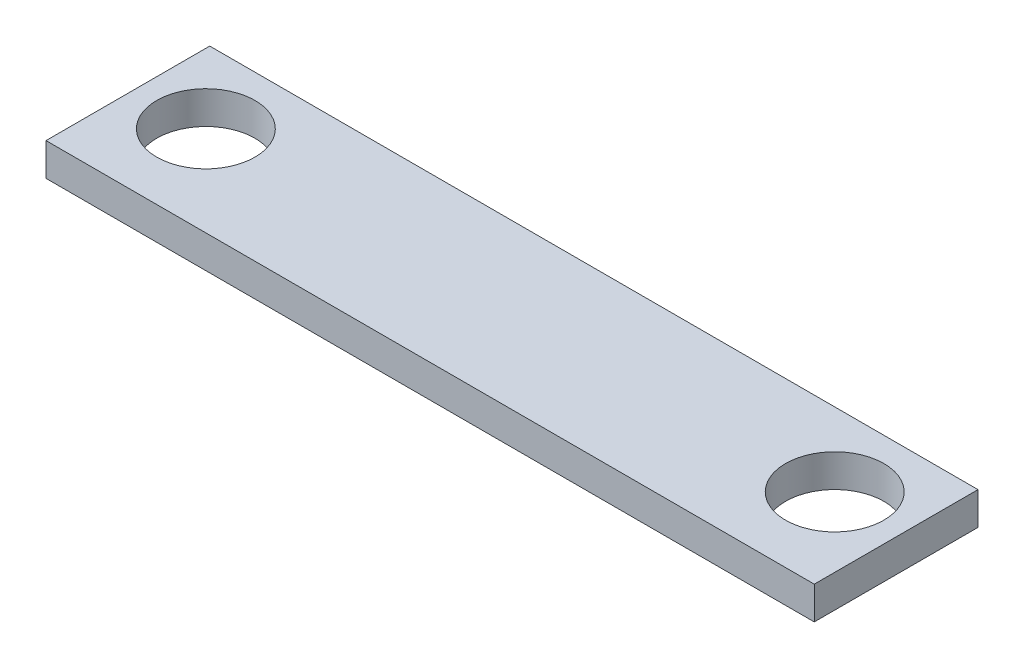
ISO-10303-21;
HEADER;
FILE_DESCRIPTION(('STEP AP214'),'2;1');
FILE_NAME('part.step','',(''),(''),'','','');
FILE_SCHEMA(('AUTOMOTIVE_DESIGN { 1 0 10303 214 1 1 1 1 }'));
ENDSEC;
DATA;
#1=APPLICATION_CONTEXT('core data for automotive mechanical design processes');
#2=APPLICATION_PROTOCOL_DEFINITION('international standard','automotive_design',2000,#1);
#3=PRODUCT_CONTEXT('',#1,'mechanical');
#4=PRODUCT('Part','Part','',(#3));
#5=PRODUCT_RELATED_PRODUCT_CATEGORY('part','',(#4));
#6=PRODUCT_DEFINITION_FORMATION('','',#4);
#7=PRODUCT_DEFINITION_CONTEXT('part definition',#1,'design');
#8=PRODUCT_DEFINITION('design','',#6,#7);
#9=PRODUCT_DEFINITION_SHAPE('','',#8);
#10=(LENGTH_UNIT() NAMED_UNIT(*) SI_UNIT(.MILLI.,.METRE.));
#11=(NAMED_UNIT(*) PLANE_ANGLE_UNIT() SI_UNIT($,.RADIAN.));
#12=(NAMED_UNIT(*) SI_UNIT($,.STERADIAN.) SOLID_ANGLE_UNIT());
#13=UNCERTAINTY_MEASURE_WITH_UNIT(LENGTH_MEASURE(1.E-05),#10,'distance_accuracy_value','');
#14=(GEOMETRIC_REPRESENTATION_CONTEXT(3) GLOBAL_UNCERTAINTY_ASSIGNED_CONTEXT((#13)) GLOBAL_UNIT_ASSIGNED_CONTEXT((#10,
#11,#12)) REPRESENTATION_CONTEXT('',''));
#15=CARTESIAN_POINT('',(0.,0.,0.));
#16=DIRECTION('',(0.,0.,1.));
#17=DIRECTION('',(1.,0.,0.));
#18=AXIS2_PLACEMENT_3D('',#15,#16,#17);
#19=CARTESIAN_POINT('',(-11.73,1.,5.));
#20=DIRECTION('',(0.,0.,-1.));
#21=DIRECTION('',(-1.,0.,0.));
#22=AXIS2_PLACEMENT_3D('',#19,#20,#21);
#23=PLANE('',#22);
#24=DIRECTION('',(1.,0.,0.));
#25=VECTOR('',#24,1.);
#26=CARTESIAN_POINT('',(-11.73,0.,5.));
#27=LINE('',#26,#25);
#28=CARTESIAN_POINT('',(-11.73,0.,5.));
#29=VERTEX_POINT('',#28);
#30=CARTESIAN_POINT('',(11.73,0.,5.));
#31=VERTEX_POINT('',#30);
#32=EDGE_CURVE('E106',#29,#31,#27,.T.);
#33=ORIENTED_EDGE('',*,*,#32,.T.);
#34=DIRECTION('',(0.,-1.,0.));
#35=VECTOR('',#34,1.);
#36=CARTESIAN_POINT('',(11.73,1.,5.));
#37=LINE('',#36,#35);
#38=CARTESIAN_POINT('',(11.73,1.,5.));
#39=VERTEX_POINT('',#38);
#40=EDGE_CURVE('E11',#39,#31,#37,.T.);
#41=ORIENTED_EDGE('',*,*,#40,.F.);
#42=DIRECTION('',(1.,0.,0.));
#43=VECTOR('',#42,1.);
#44=CARTESIAN_POINT('',(-11.73,1.,5.));
#45=LINE('',#44,#43);
#46=CARTESIAN_POINT('',(-11.73,1.,5.));
#47=VERTEX_POINT('',#46);
#48=EDGE_CURVE('E83',#47,#39,#45,.T.);
#49=ORIENTED_EDGE('',*,*,#48,.F.);
#50=DIRECTION('',(0.,-1.,0.));
#51=VECTOR('',#50,1.);
#52=CARTESIAN_POINT('',(-11.73,1.,5.));
#53=LINE('',#52,#51);
#54=EDGE_CURVE('E59',#47,#29,#53,.T.);
#55=ORIENTED_EDGE('',*,*,#54,.T.);
#56=EDGE_LOOP('',(#33,#41,#49,#55));
#57=FACE_BOUND('',#56,.T.);
#58=ADVANCED_FACE('F43',(#57),#23,.F.);
#59=CARTESIAN_POINT('',(11.73,1.,0.));
#60=DIRECTION('',(1.,0.,0.));
#61=DIRECTION('',(0.,0.,-1.));
#62=AXIS2_PLACEMENT_3D('',#59,#60,#61);
#63=PLANE('',#62);
#64=DIRECTION('',(0.,0.,1.));
#65=VECTOR('',#64,1.);
#66=CARTESIAN_POINT('',(11.73,0.,0.));
#67=LINE('',#66,#65);
#68=CARTESIAN_POINT('',(11.73,0.,0.));
#69=VERTEX_POINT('',#68);
#70=EDGE_CURVE('E92',#69,#31,#67,.T.);
#71=ORIENTED_EDGE('',*,*,#70,.F.);
#72=DIRECTION('',(0.,-1.,0.));
#73=VECTOR('',#72,1.);
#74=CARTESIAN_POINT('',(11.73,1.,0.));
#75=LINE('',#74,#73);
#76=CARTESIAN_POINT('',(11.73,1.,0.));
#77=VERTEX_POINT('',#76);
#78=EDGE_CURVE('E51',#77,#69,#75,.T.);
#79=ORIENTED_EDGE('',*,*,#78,.F.);
#80=DIRECTION('',(0.,0.,1.));
#81=VECTOR('',#80,1.);
#82=CARTESIAN_POINT('',(11.73,1.,0.));
#83=LINE('',#82,#81);
#84=EDGE_CURVE('E90',#77,#39,#83,.T.);
#85=ORIENTED_EDGE('',*,*,#84,.T.);
#86=ORIENTED_EDGE('',*,*,#40,.T.);
#87=EDGE_LOOP('',(#71,#79,#85,#86));
#88=FACE_BOUND('',#87,.T.);
#89=ADVANCED_FACE('F89',(#88),#63,.T.);
#90=CARTESIAN_POINT('',(-11.73,1.,0.));
#91=DIRECTION('',(0.,0.,-1.));
#92=DIRECTION('',(-1.,0.,0.));
#93=AXIS2_PLACEMENT_3D('',#90,#91,#92);
#94=PLANE('',#93);
#95=DIRECTION('',(1.,0.,0.));
#96=VECTOR('',#95,1.);
#97=CARTESIAN_POINT('',(-11.73,0.,0.));
#98=LINE('',#97,#96);
#99=CARTESIAN_POINT('',(-11.73,0.,0.));
#100=VERTEX_POINT('',#99);
#101=EDGE_CURVE('E110',#100,#69,#98,.T.);
#102=ORIENTED_EDGE('',*,*,#101,.F.);
#103=DIRECTION('',(0.,-1.,0.));
#104=VECTOR('',#103,1.);
#105=CARTESIAN_POINT('',(-11.73,1.,0.));
#106=LINE('',#105,#104);
#107=CARTESIAN_POINT('',(-11.73,1.,0.));
#108=VERTEX_POINT('',#107);
#109=EDGE_CURVE('E72',#108,#100,#106,.T.);
#110=ORIENTED_EDGE('',*,*,#109,.F.);
#111=DIRECTION('',(1.,0.,0.));
#112=VECTOR('',#111,1.);
#113=CARTESIAN_POINT('',(-11.73,1.,0.));
#114=LINE('',#113,#112);
#115=EDGE_CURVE('E98',#108,#77,#114,.T.);
#116=ORIENTED_EDGE('',*,*,#115,.T.);
#117=ORIENTED_EDGE('',*,*,#78,.T.);
#118=EDGE_LOOP('',(#102,#110,#116,#117));
#119=FACE_BOUND('',#118,.T.);
#120=ADVANCED_FACE('F100',(#119),#94,.T.);
#121=CARTESIAN_POINT('',(-11.73,1.,5.));
#122=DIRECTION('',(-1.,0.,0.));
#123=DIRECTION('',(0.,0.,1.));
#124=AXIS2_PLACEMENT_3D('',#121,#122,#123);
#125=PLANE('',#124);
#126=DIRECTION('',(0.,0.,-1.));
#127=VECTOR('',#126,1.);
#128=CARTESIAN_POINT('',(-11.73,0.,5.));
#129=LINE('',#128,#127);
#130=EDGE_CURVE('E112',#29,#100,#129,.T.);
#131=ORIENTED_EDGE('',*,*,#130,.F.);
#132=ORIENTED_EDGE('',*,*,#54,.F.);
#133=DIRECTION('',(0.,0.,-1.));
#134=VECTOR('',#133,1.);
#135=CARTESIAN_POINT('',(-11.73,1.,5.));
#136=LINE('',#135,#134);
#137=EDGE_CURVE('E101',#47,#108,#136,.T.);
#138=ORIENTED_EDGE('',*,*,#137,.T.);
#139=ORIENTED_EDGE('',*,*,#109,.T.);
#140=EDGE_LOOP('',(#131,#132,#138,#139));
#141=FACE_BOUND('',#140,.T.);
#142=ADVANCED_FACE('F142',(#141),#125,.T.);
#143=CARTESIAN_POINT('',(0.,1.,0.));
#144=DIRECTION('',(0.,-1.,0.));
#145=DIRECTION('',(-1.,0.,0.));
#146=AXIS2_PLACEMENT_3D('',#143,#144,#145);
#147=PLANE('',#146);
#148=CARTESIAN_POINT('',(-9.60139359295989,1.,2.24733174755368));
#149=DIRECTION('',(0.,1.,0.));
#150=DIRECTION('',(0.,0.,1.));
#151=AXIS2_PLACEMENT_3D('',#148,#149,#150);
#152=CIRCLE('',#151,1.5);
#153=CARTESIAN_POINT('',(-9.60139359295989,1.,3.74733174755369));
#154=VERTEX_POINT('',#153);
#155=EDGE_CURVE('E124',#154,#154,#152,.T.);
#156=ORIENTED_EDGE('',*,*,#155,.F.);
#157=EDGE_LOOP('',(#156));
#158=FACE_BOUND('',#157,.T.);
#159=CARTESIAN_POINT('',(9.60139359295989,1.,2.24733174755368));
#160=DIRECTION('',(0.,1.,0.));
#161=DIRECTION('',(0.,0.,-1.));
#162=AXIS2_PLACEMENT_3D('',#159,#160,#161);
#163=CIRCLE('',#162,1.5);
#164=CARTESIAN_POINT('',(9.60139359295989,1.,0.74733174755368));
#165=VERTEX_POINT('',#164);
#166=EDGE_CURVE('E121',#165,#165,#163,.T.);
#167=ORIENTED_EDGE('',*,*,#166,.F.);
#168=EDGE_LOOP('',(#167));
#169=FACE_BOUND('',#168,.T.);
#170=ORIENTED_EDGE('',*,*,#48,.T.);
#171=ORIENTED_EDGE('',*,*,#84,.F.);
#172=ORIENTED_EDGE('',*,*,#115,.F.);
#173=ORIENTED_EDGE('',*,*,#137,.F.);
#174=EDGE_LOOP('',(#170,#171,#172,#173));
#175=FACE_BOUND('',#174,.T.);
#176=ADVANCED_FACE('F97',(#158,#169,#175),#147,.F.);
#177=CARTESIAN_POINT('',(0.,0.,0.));
#178=DIRECTION('',(0.,-1.,0.));
#179=DIRECTION('',(-1.,0.,0.));
#180=AXIS2_PLACEMENT_3D('',#177,#178,#179);
#181=PLANE('',#180);
#182=CARTESIAN_POINT('',(-9.60139359295989,0.,2.24733174755368));
#183=DIRECTION('',(0.,1.,0.));
#184=DIRECTION('',(0.,0.,1.));
#185=AXIS2_PLACEMENT_3D('',#182,#183,#184);
#186=CIRCLE('',#185,1.5);
#187=CARTESIAN_POINT('',(-9.60139359295989,0.,3.74733174755369));
#188=VERTEX_POINT('',#187);
#189=EDGE_CURVE('E108',#188,#188,#186,.T.);
#190=ORIENTED_EDGE('',*,*,#189,.T.);
#191=EDGE_LOOP('',(#190));
#192=FACE_BOUND('',#191,.T.);
#193=CARTESIAN_POINT('',(9.60139359295989,0.,2.24733174755368));
#194=DIRECTION('',(0.,1.,0.));
#195=DIRECTION('',(0.,0.,-1.));
#196=AXIS2_PLACEMENT_3D('',#193,#194,#195);
#197=CIRCLE('',#196,1.5);
#198=CARTESIAN_POINT('',(9.60139359295989,0.,0.74733174755368));
#199=VERTEX_POINT('',#198);
#200=EDGE_CURVE('E118',#199,#199,#197,.T.);
#201=ORIENTED_EDGE('',*,*,#200,.T.);
#202=EDGE_LOOP('',(#201));
#203=FACE_BOUND('',#202,.T.);
#204=ORIENTED_EDGE('',*,*,#32,.F.);
#205=ORIENTED_EDGE('',*,*,#130,.T.);
#206=ORIENTED_EDGE('',*,*,#101,.T.);
#207=ORIENTED_EDGE('',*,*,#70,.T.);
#208=EDGE_LOOP('',(#204,#205,#206,#207));
#209=FACE_BOUND('',#208,.T.);
#210=ADVANCED_FACE('F130',(#192,#203,#209),#181,.T.);
#211=CARTESIAN_POINT('',(9.60139359295989,0.,2.24733174755368));
#212=DIRECTION('',(0.,1.,0.));
#213=DIRECTION('',(0.,0.,1.));
#214=AXIS2_PLACEMENT_3D('',#211,#212,#213);
#215=CYLINDRICAL_SURFACE('',#214,1.5);
#216=ORIENTED_EDGE('',*,*,#200,.F.);
#217=EDGE_LOOP('',(#216));
#218=FACE_BOUND('',#217,.T.);
#219=ORIENTED_EDGE('',*,*,#166,.T.);
#220=EDGE_LOOP('',(#219));
#221=FACE_BOUND('',#220,.T.);
#222=ADVANCED_FACE('F136',(#218,#221),#215,.F.);
#223=CARTESIAN_POINT('',(-9.60139359295989,0.,2.24733174755368));
#224=DIRECTION('',(0.,1.,0.));
#225=DIRECTION('',(0.,0.,1.));
#226=AXIS2_PLACEMENT_3D('',#223,#224,#225);
#227=CYLINDRICAL_SURFACE('',#226,1.5);
#228=ORIENTED_EDGE('',*,*,#189,.F.);
#229=EDGE_LOOP('',(#228));
#230=FACE_BOUND('',#229,.T.);
#231=ORIENTED_EDGE('',*,*,#155,.T.);
#232=EDGE_LOOP('',(#231));
#233=FACE_BOUND('',#232,.T.);
#234=ADVANCED_FACE('F133',(#230,#233),#227,.F.);
#235=CLOSED_SHELL('',(#58,#89,#120,#142,#176,#210,#222,#234));
#236=MANIFOLD_SOLID_BREP('B2',#235);
#237=ADVANCED_BREP_SHAPE_REPRESENTATION('',(#18,#236),#14);
#238=SHAPE_DEFINITION_REPRESENTATION(#9,#237);
ENDSEC;
END-ISO-10303-21;
